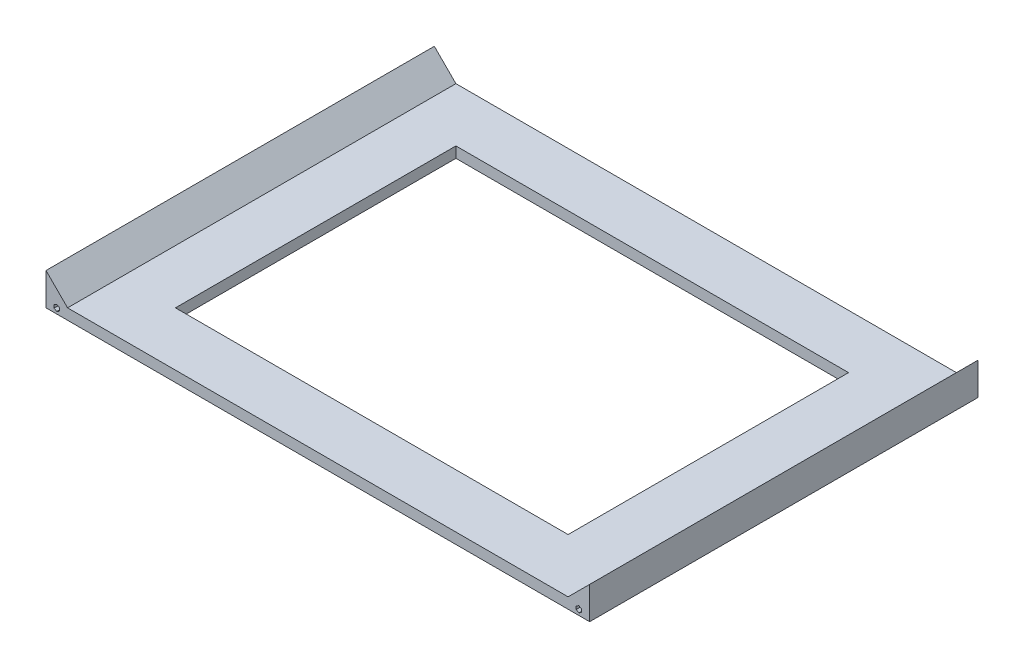
ISO-10303-21;
HEADER;
FILE_DESCRIPTION(('STEP AP214'),'2;1');
FILE_NAME('part.step','',(''),(''),'','','');
FILE_SCHEMA(('AUTOMOTIVE_DESIGN { 1 0 10303 214 1 1 1 1 }'));
ENDSEC;
DATA;
#1=APPLICATION_CONTEXT('core data for automotive mechanical design processes');
#2=APPLICATION_PROTOCOL_DEFINITION('international standard','automotive_design',2000,#1);
#3=PRODUCT_CONTEXT('',#1,'mechanical');
#4=PRODUCT('Part','Part','',(#3));
#5=PRODUCT_RELATED_PRODUCT_CATEGORY('part','',(#4));
#6=PRODUCT_DEFINITION_FORMATION('','',#4);
#7=PRODUCT_DEFINITION_CONTEXT('part definition',#1,'design');
#8=PRODUCT_DEFINITION('design','',#6,#7);
#9=PRODUCT_DEFINITION_SHAPE('','',#8);
#10=(LENGTH_UNIT() NAMED_UNIT(*) SI_UNIT(.MILLI.,.METRE.));
#11=(NAMED_UNIT(*) PLANE_ANGLE_UNIT() SI_UNIT($,.RADIAN.));
#12=(NAMED_UNIT(*) SI_UNIT($,.STERADIAN.) SOLID_ANGLE_UNIT());
#13=UNCERTAINTY_MEASURE_WITH_UNIT(LENGTH_MEASURE(1.E-05),#10,'distance_accuracy_value','');
#14=(GEOMETRIC_REPRESENTATION_CONTEXT(3) GLOBAL_UNCERTAINTY_ASSIGNED_CONTEXT((#13)) GLOBAL_UNIT_ASSIGNED_CONTEXT((#10,
#11,#12)) REPRESENTATION_CONTEXT('',''));
#15=CARTESIAN_POINT('',(0.,0.,0.));
#16=DIRECTION('',(0.,0.,1.));
#17=DIRECTION('',(1.,0.,0.));
#18=AXIS2_PLACEMENT_3D('',#15,#16,#17);
#19=CARTESIAN_POINT('',(-126.,0.,-90.));
#20=DIRECTION('',(-1.,0.,0.));
#21=DIRECTION('',(0.,0.,1.));
#22=AXIS2_PLACEMENT_3D('',#19,#20,#21);
#23=PLANE('',#22);
#24=DIRECTION('',(0.,0.,1.));
#25=VECTOR('',#24,1.);
#26=CARTESIAN_POINT('',(-126.,0.,-90.));
#27=LINE('',#26,#25);
#28=CARTESIAN_POINT('',(-126.,0.,-90.));
#29=VERTEX_POINT('',#28);
#30=CARTESIAN_POINT('',(-126.,0.,90.));
#31=VERTEX_POINT('',#30);
#32=EDGE_CURVE('E48',#29,#31,#27,.T.);
#33=ORIENTED_EDGE('',*,*,#32,.T.);
#34=DIRECTION('',(0.,-1.,0.));
#35=VECTOR('',#34,1.);
#36=CARTESIAN_POINT('',(-126.,0.,90.));
#37=LINE('',#36,#35);
#38=CARTESIAN_POINT('',(-126.,15.,90.));
#39=VERTEX_POINT('',#38);
#40=EDGE_CURVE('E276',#39,#31,#37,.T.);
#41=ORIENTED_EDGE('',*,*,#40,.F.);
#42=DIRECTION('',(0.,0.,1.));
#43=VECTOR('',#42,1.);
#44=CARTESIAN_POINT('',(-126.,15.,-90.));
#45=LINE('',#44,#43);
#46=CARTESIAN_POINT('',(-126.,15.,-90.));
#47=VERTEX_POINT('',#46);
#48=EDGE_CURVE('E11',#47,#39,#45,.T.);
#49=ORIENTED_EDGE('',*,*,#48,.F.);
#50=DIRECTION('',(0.,-1.,0.));
#51=VECTOR('',#50,1.);
#52=CARTESIAN_POINT('',(-126.,0.,-90.));
#53=LINE('',#52,#51);
#54=EDGE_CURVE('E364',#47,#29,#53,.T.);
#55=ORIENTED_EDGE('',*,*,#54,.T.);
#56=EDGE_LOOP('',(#33,#41,#49,#55));
#57=FACE_BOUND('',#56,.T.);
#58=ADVANCED_FACE('F45',(#57),#23,.T.);
#59=CARTESIAN_POINT('',(-126.,15.,-90.));
#60=DIRECTION('',(0.707106781186549,0.707106781186546,0.));
#61=DIRECTION('',(-0.707106781186546,0.707106781186549,0.));
#62=AXIS2_PLACEMENT_3D('',#59,#60,#61);
#63=PLANE('',#62);
#64=ORIENTED_EDGE('',*,*,#48,.T.);
#65=DIRECTION('',(-0.707106781186546,0.707106781186549,0.));
#66=VECTOR('',#65,1.);
#67=CARTESIAN_POINT('',(-126.,15.,90.));
#68=LINE('',#67,#66);
#69=CARTESIAN_POINT('',(-116.,5.,90.));
#70=VERTEX_POINT('',#69);
#71=EDGE_CURVE('E361',#70,#39,#68,.T.);
#72=ORIENTED_EDGE('',*,*,#71,.F.);
#73=DIRECTION('',(0.,0.,1.));
#74=VECTOR('',#73,1.);
#75=CARTESIAN_POINT('',(-116.,5.,-90.));
#76=LINE('',#75,#74);
#77=CARTESIAN_POINT('',(-116.,5.,-90.));
#78=VERTEX_POINT('',#77);
#79=EDGE_CURVE('E53',#78,#70,#76,.T.);
#80=ORIENTED_EDGE('',*,*,#79,.F.);
#81=DIRECTION('',(-0.707106781186546,0.707106781186549,0.));
#82=VECTOR('',#81,1.);
#83=CARTESIAN_POINT('',(-126.,15.,-90.));
#84=LINE('',#83,#82);
#85=EDGE_CURVE('E379',#78,#47,#84,.T.);
#86=ORIENTED_EDGE('',*,*,#85,.T.);
#87=EDGE_LOOP('',(#64,#72,#80,#86));
#88=FACE_BOUND('',#87,.T.);
#89=ADVANCED_FACE('F399',(#88),#63,.T.);
#90=CARTESIAN_POINT('',(-116.,5.,-90.));
#91=DIRECTION('',(0.,1.,0.));
#92=DIRECTION('',(0.,0.,1.));
#93=AXIS2_PLACEMENT_3D('',#90,#91,#92);
#94=PLANE('',#93);
#95=DIRECTION('',(-1.,0.,0.));
#96=VECTOR('',#95,1.);
#97=CARTESIAN_POINT('',(91.,5.,-65.));
#98=LINE('',#97,#96);
#99=CARTESIAN_POINT('',(91.,5.,-65.));
#100=VERTEX_POINT('',#99);
#101=CARTESIAN_POINT('',(-91.,5.,-65.));
#102=VERTEX_POINT('',#101);
#103=EDGE_CURVE('E61',#100,#102,#98,.T.);
#104=ORIENTED_EDGE('',*,*,#103,.F.);
#105=DIRECTION('',(0.,0.,-1.));
#106=VECTOR('',#105,1.);
#107=CARTESIAN_POINT('',(91.,5.,65.));
#108=LINE('',#107,#106);
#109=CARTESIAN_POINT('',(91.,5.,65.));
#110=VERTEX_POINT('',#109);
#111=EDGE_CURVE('E218',#110,#100,#108,.T.);
#112=ORIENTED_EDGE('',*,*,#111,.F.);
#113=DIRECTION('',(1.,0.,0.));
#114=VECTOR('',#113,1.);
#115=CARTESIAN_POINT('',(-91.,5.,65.));
#116=LINE('',#115,#114);
#117=CARTESIAN_POINT('',(-91.,5.,65.));
#118=VERTEX_POINT('',#117);
#119=EDGE_CURVE('E221',#118,#110,#116,.T.);
#120=ORIENTED_EDGE('',*,*,#119,.F.);
#121=DIRECTION('',(0.,0.,1.));
#122=VECTOR('',#121,1.);
#123=CARTESIAN_POINT('',(-91.,5.,-65.));
#124=LINE('',#123,#122);
#125=EDGE_CURVE('E227',#102,#118,#124,.T.);
#126=ORIENTED_EDGE('',*,*,#125,.F.);
#127=EDGE_LOOP('',(#104,#112,#120,#126));
#128=FACE_BOUND('',#127,.T.);
#129=ORIENTED_EDGE('',*,*,#79,.T.);
#130=DIRECTION('',(-1.,0.,0.));
#131=VECTOR('',#130,1.);
#132=CARTESIAN_POINT('',(-116.,5.,90.));
#133=LINE('',#132,#131);
#134=CARTESIAN_POINT('',(116.,5.,90.));
#135=VERTEX_POINT('',#134);
#136=EDGE_CURVE('E358',#135,#70,#133,.T.);
#137=ORIENTED_EDGE('',*,*,#136,.F.);
#138=DIRECTION('',(0.,0.,1.));
#139=VECTOR('',#138,1.);
#140=CARTESIAN_POINT('',(116.,5.,-90.));
#141=LINE('',#140,#139);
#142=CARTESIAN_POINT('',(116.,5.,-90.));
#143=VERTEX_POINT('',#142);
#144=EDGE_CURVE('E383',#143,#135,#141,.T.);
#145=ORIENTED_EDGE('',*,*,#144,.F.);
#146=DIRECTION('',(-1.,0.,0.));
#147=VECTOR('',#146,1.);
#148=CARTESIAN_POINT('',(-116.,5.,-90.));
#149=LINE('',#148,#147);
#150=EDGE_CURVE('E376',#143,#78,#149,.T.);
#151=ORIENTED_EDGE('',*,*,#150,.T.);
#152=EDGE_LOOP('',(#129,#137,#145,#151));
#153=FACE_BOUND('',#152,.T.);
#154=ADVANCED_FACE('F412',(#128,#153),#94,.T.);
#155=CARTESIAN_POINT('',(116.,5.,-90.));
#156=DIRECTION('',(-0.707106781186549,0.707106781186546,0.));
#157=DIRECTION('',(-0.707106781186546,-0.707106781186549,0.));
#158=AXIS2_PLACEMENT_3D('',#155,#156,#157);
#159=PLANE('',#158);
#160=ORIENTED_EDGE('',*,*,#144,.T.);
#161=DIRECTION('',(-0.707106781186546,-0.707106781186549,0.));
#162=VECTOR('',#161,1.);
#163=CARTESIAN_POINT('',(116.,5.,90.));
#164=LINE('',#163,#162);
#165=CARTESIAN_POINT('',(126.,15.,90.));
#166=VERTEX_POINT('',#165);
#167=EDGE_CURVE('E355',#166,#135,#164,.T.);
#168=ORIENTED_EDGE('',*,*,#167,.F.);
#169=DIRECTION('',(0.,0.,1.));
#170=VECTOR('',#169,1.);
#171=CARTESIAN_POINT('',(126.,15.,-90.));
#172=LINE('',#171,#170);
#173=CARTESIAN_POINT('',(126.,15.,-90.));
#174=VERTEX_POINT('',#173);
#175=EDGE_CURVE('E385',#174,#166,#172,.T.);
#176=ORIENTED_EDGE('',*,*,#175,.F.);
#177=DIRECTION('',(-0.707106781186546,-0.707106781186549,0.));
#178=VECTOR('',#177,1.);
#179=CARTESIAN_POINT('',(116.,5.,-90.));
#180=LINE('',#179,#178);
#181=EDGE_CURVE('E373',#174,#143,#180,.T.);
#182=ORIENTED_EDGE('',*,*,#181,.T.);
#183=EDGE_LOOP('',(#160,#168,#176,#182));
#184=FACE_BOUND('',#183,.T.);
#185=ADVANCED_FACE('F410',(#184),#159,.T.);
#186=CARTESIAN_POINT('',(126.,15.,-90.));
#187=DIRECTION('',(1.,0.,0.));
#188=DIRECTION('',(0.,0.,-1.));
#189=AXIS2_PLACEMENT_3D('',#186,#187,#188);
#190=PLANE('',#189);
#191=ORIENTED_EDGE('',*,*,#175,.T.);
#192=DIRECTION('',(0.,1.,0.));
#193=VECTOR('',#192,1.);
#194=CARTESIAN_POINT('',(126.,15.,90.));
#195=LINE('',#194,#193);
#196=CARTESIAN_POINT('',(126.,0.,90.));
#197=VERTEX_POINT('',#196);
#198=EDGE_CURVE('E352',#197,#166,#195,.T.);
#199=ORIENTED_EDGE('',*,*,#198,.F.);
#200=DIRECTION('',(0.,0.,1.));
#201=VECTOR('',#200,1.);
#202=CARTESIAN_POINT('',(126.,0.,-90.));
#203=LINE('',#202,#201);
#204=CARTESIAN_POINT('',(126.,0.,-90.));
#205=VERTEX_POINT('',#204);
#206=EDGE_CURVE('E386',#205,#197,#203,.T.);
#207=ORIENTED_EDGE('',*,*,#206,.F.);
#208=DIRECTION('',(0.,1.,0.));
#209=VECTOR('',#208,1.);
#210=CARTESIAN_POINT('',(126.,15.,-90.));
#211=LINE('',#210,#209);
#212=EDGE_CURVE('E370',#205,#174,#211,.T.);
#213=ORIENTED_EDGE('',*,*,#212,.T.);
#214=EDGE_LOOP('',(#191,#199,#207,#213));
#215=FACE_BOUND('',#214,.T.);
#216=ADVANCED_FACE('F407',(#215),#190,.T.);
#217=CARTESIAN_POINT('',(-126.,0.,-90.));
#218=DIRECTION('',(0.,-1.,0.));
#219=DIRECTION('',(0.,0.,-1.));
#220=AXIS2_PLACEMENT_3D('',#217,#218,#219);
#221=PLANE('',#220);
#222=DIRECTION('',(-1.,0.,0.));
#223=VECTOR('',#222,1.);
#224=CARTESIAN_POINT('',(91.,0.,-65.));
#225=LINE('',#224,#223);
#226=CARTESIAN_POINT('',(91.,0.,-65.));
#227=VERTEX_POINT('',#226);
#228=CARTESIAN_POINT('',(-91.,0.,-65.));
#229=VERTEX_POINT('',#228);
#230=EDGE_CURVE('E202',#227,#229,#225,.T.);
#231=ORIENTED_EDGE('',*,*,#230,.T.);
#232=DIRECTION('',(0.,0.,1.));
#233=VECTOR('',#232,1.);
#234=CARTESIAN_POINT('',(-91.,0.,-65.));
#235=LINE('',#234,#233);
#236=CARTESIAN_POINT('',(-91.,0.,65.));
#237=VERTEX_POINT('',#236);
#238=EDGE_CURVE('E211',#229,#237,#235,.T.);
#239=ORIENTED_EDGE('',*,*,#238,.T.);
#240=DIRECTION('',(1.,0.,0.));
#241=VECTOR('',#240,1.);
#242=CARTESIAN_POINT('',(-91.,0.,65.));
#243=LINE('',#242,#241);
#244=CARTESIAN_POINT('',(91.,0.,65.));
#245=VERTEX_POINT('',#244);
#246=EDGE_CURVE('E69',#237,#245,#243,.T.);
#247=ORIENTED_EDGE('',*,*,#246,.T.);
#248=DIRECTION('',(0.,0.,-1.));
#249=VECTOR('',#248,1.);
#250=CARTESIAN_POINT('',(91.,0.,65.));
#251=LINE('',#250,#249);
#252=EDGE_CURVE('E208',#245,#227,#251,.T.);
#253=ORIENTED_EDGE('',*,*,#252,.T.);
#254=EDGE_LOOP('',(#231,#239,#247,#253));
#255=FACE_BOUND('',#254,.T.);
#256=ORIENTED_EDGE('',*,*,#206,.T.);
#257=DIRECTION('',(1.,0.,0.));
#258=VECTOR('',#257,1.);
#259=CARTESIAN_POINT('',(-126.,0.,90.));
#260=LINE('',#259,#258);
#261=EDGE_CURVE('E348',#31,#197,#260,.T.);
#262=ORIENTED_EDGE('',*,*,#261,.F.);
#263=ORIENTED_EDGE('',*,*,#32,.F.);
#264=DIRECTION('',(1.,0.,0.));
#265=VECTOR('',#264,1.);
#266=CARTESIAN_POINT('',(-126.,0.,-90.));
#267=LINE('',#266,#265);
#268=EDGE_CURVE('E367',#29,#205,#267,.T.);
#269=ORIENTED_EDGE('',*,*,#268,.T.);
#270=EDGE_LOOP('',(#256,#262,#263,#269));
#271=FACE_BOUND('',#270,.T.);
#272=ADVANCED_FACE('F215',(#255,#271),#221,.T.);
#273=CARTESIAN_POINT('',(0.,0.,-90.));
#274=DIRECTION('',(0.,0.,-1.));
#275=DIRECTION('',(-1.,0.,0.));
#276=AXIS2_PLACEMENT_3D('',#273,#274,#275);
#277=PLANE('',#276);
#278=DIRECTION('',(0.,-1.,0.));
#279=VECTOR('',#278,1.);
#280=CARTESIAN_POINT('',(119.75,1.77831216351297,-90.));
#281=LINE('',#280,#279);
#282=CARTESIAN_POINT('',(119.75,3.22168783648702,-90.));
#283=VERTEX_POINT('',#282);
#284=CARTESIAN_POINT('',(119.75,1.77831216351297,-90.));
#285=VERTEX_POINT('',#284);
#286=EDGE_CURVE('E237',#283,#285,#281,.T.);
#287=ORIENTED_EDGE('',*,*,#286,.T.);
#288=DIRECTION('',(0.866025403784439,-0.5,0.));
#289=VECTOR('',#288,1.);
#290=CARTESIAN_POINT('',(121.,1.05662432702594,-90.));
#291=LINE('',#290,#289);
#292=CARTESIAN_POINT('',(121.,1.05662432702594,-90.));
#293=VERTEX_POINT('',#292);
#294=EDGE_CURVE('E240',#285,#293,#291,.T.);
#295=ORIENTED_EDGE('',*,*,#294,.T.);
#296=DIRECTION('',(0.866025403784438,0.500000000000001,0.));
#297=VECTOR('',#296,1.);
#298=CARTESIAN_POINT('',(122.25,1.77831216351296,-90.));
#299=LINE('',#298,#297);
#300=CARTESIAN_POINT('',(122.25,1.77831216351296,-90.));
#301=VERTEX_POINT('',#300);
#302=EDGE_CURVE('E244',#293,#301,#299,.T.);
#303=ORIENTED_EDGE('',*,*,#302,.T.);
#304=DIRECTION('',(0.,1.,0.));
#305=VECTOR('',#304,1.);
#306=CARTESIAN_POINT('',(122.25,3.22168783648703,-90.));
#307=LINE('',#306,#305);
#308=CARTESIAN_POINT('',(122.25,3.22168783648703,-90.));
#309=VERTEX_POINT('',#308);
#310=EDGE_CURVE('E247',#301,#309,#307,.T.);
#311=ORIENTED_EDGE('',*,*,#310,.T.);
#312=DIRECTION('',(-0.866025403784439,0.499999999999999,0.));
#313=VECTOR('',#312,1.);
#314=CARTESIAN_POINT('',(121.,3.94337567297405,-90.));
#315=LINE('',#314,#313);
#316=CARTESIAN_POINT('',(121.,3.94337567297405,-90.));
#317=VERTEX_POINT('',#316);
#318=EDGE_CURVE('E250',#309,#317,#315,.T.);
#319=ORIENTED_EDGE('',*,*,#318,.T.);
#320=DIRECTION('',(-0.866025403784438,-0.500000000000002,0.));
#321=VECTOR('',#320,1.);
#322=CARTESIAN_POINT('',(119.75,3.22168783648702,-90.));
#323=LINE('',#322,#321);
#324=EDGE_CURVE('E253',#317,#283,#323,.T.);
#325=ORIENTED_EDGE('',*,*,#324,.T.);
#326=EDGE_LOOP('',(#287,#295,#303,#311,#319,#325));
#327=FACE_BOUND('',#326,.T.);
#328=DIRECTION('',(-0.866025403784438,0.500000000000002,0.));
#329=VECTOR('',#328,1.);
#330=CARTESIAN_POINT('',(-119.75,3.22168783648702,-90.));
#331=LINE('',#330,#329);
#332=CARTESIAN_POINT('',(-119.75,3.22168783648702,-90.));
#333=VERTEX_POINT('',#332);
#334=CARTESIAN_POINT('',(-121.,3.94337567297405,-90.));
#335=VERTEX_POINT('',#334);
#336=EDGE_CURVE('E311',#333,#335,#331,.T.);
#337=ORIENTED_EDGE('',*,*,#336,.T.);
#338=DIRECTION('',(-0.866025403784439,-0.499999999999999,0.));
#339=VECTOR('',#338,1.);
#340=CARTESIAN_POINT('',(-121.,3.94337567297405,-90.));
#341=LINE('',#340,#339);
#342=CARTESIAN_POINT('',(-122.25,3.22168783648703,-90.));
#343=VERTEX_POINT('',#342);
#344=EDGE_CURVE('E340',#335,#343,#341,.T.);
#345=ORIENTED_EDGE('',*,*,#344,.T.);
#346=DIRECTION('',(0.,-1.,0.));
#347=VECTOR('',#346,1.);
#348=CARTESIAN_POINT('',(-122.25,3.22168783648703,-90.));
#349=LINE('',#348,#347);
#350=CARTESIAN_POINT('',(-122.25,1.77831216351296,-90.));
#351=VERTEX_POINT('',#350);
#352=EDGE_CURVE('E337',#343,#351,#349,.T.);
#353=ORIENTED_EDGE('',*,*,#352,.T.);
#354=DIRECTION('',(0.866025403784438,-0.500000000000001,0.));
#355=VECTOR('',#354,1.);
#356=CARTESIAN_POINT('',(-122.25,1.77831216351296,-90.));
#357=LINE('',#356,#355);
#358=CARTESIAN_POINT('',(-121.,1.05662432702594,-90.));
#359=VERTEX_POINT('',#358);
#360=EDGE_CURVE('E334',#351,#359,#357,.T.);
#361=ORIENTED_EDGE('',*,*,#360,.T.);
#362=DIRECTION('',(0.866025403784439,0.5,0.));
#363=VECTOR('',#362,1.);
#364=CARTESIAN_POINT('',(-121.,1.05662432702594,-90.));
#365=LINE('',#364,#363);
#366=CARTESIAN_POINT('',(-119.75,1.77831216351297,-90.));
#367=VERTEX_POINT('',#366);
#368=EDGE_CURVE('E331',#359,#367,#365,.T.);
#369=ORIENTED_EDGE('',*,*,#368,.T.);
#370=DIRECTION('',(0.,1.,0.));
#371=VECTOR('',#370,1.);
#372=CARTESIAN_POINT('',(-119.75,1.77831216351297,-90.));
#373=LINE('',#372,#371);
#374=EDGE_CURVE('E291',#367,#333,#373,.T.);
#375=ORIENTED_EDGE('',*,*,#374,.T.);
#376=EDGE_LOOP('',(#337,#345,#353,#361,#369,#375));
#377=FACE_BOUND('',#376,.T.);
#378=ORIENTED_EDGE('',*,*,#54,.F.);
#379=ORIENTED_EDGE('',*,*,#85,.F.);
#380=ORIENTED_EDGE('',*,*,#150,.F.);
#381=ORIENTED_EDGE('',*,*,#181,.F.);
#382=ORIENTED_EDGE('',*,*,#212,.F.);
#383=ORIENTED_EDGE('',*,*,#268,.F.);
#384=EDGE_LOOP('',(#378,#379,#380,#381,#382,#383));
#385=FACE_BOUND('',#384,.T.);
#386=ADVANCED_FACE('F402',(#327,#377,#385),#277,.T.);
#387=CARTESIAN_POINT('',(0.,0.,90.));
#388=DIRECTION('',(0.,0.,-1.));
#389=DIRECTION('',(-1.,0.,0.));
#390=AXIS2_PLACEMENT_3D('',#387,#388,#389);
#391=PLANE('',#390);
#392=DIRECTION('',(0.866025403784439,-0.5,0.));
#393=VECTOR('',#392,1.);
#394=CARTESIAN_POINT('',(121.,1.05662432702594,90.));
#395=LINE('',#394,#393);
#396=CARTESIAN_POINT('',(119.75,1.77831216351297,90.));
#397=VERTEX_POINT('',#396);
#398=CARTESIAN_POINT('',(121.,1.05662432702594,90.));
#399=VERTEX_POINT('',#398);
#400=EDGE_CURVE('E259',#397,#399,#395,.T.);
#401=ORIENTED_EDGE('',*,*,#400,.F.);
#402=DIRECTION('',(0.,-1.,0.));
#403=VECTOR('',#402,1.);
#404=CARTESIAN_POINT('',(119.75,1.77831216351297,90.));
#405=LINE('',#404,#403);
#406=CARTESIAN_POINT('',(119.75,3.22168783648702,90.));
#407=VERTEX_POINT('',#406);
#408=EDGE_CURVE('E257',#407,#397,#405,.T.);
#409=ORIENTED_EDGE('',*,*,#408,.F.);
#410=DIRECTION('',(-0.866025403784438,-0.500000000000002,0.));
#411=VECTOR('',#410,1.);
#412=CARTESIAN_POINT('',(119.75,3.22168783648702,90.));
#413=LINE('',#412,#411);
#414=CARTESIAN_POINT('',(121.,3.94337567297405,90.));
#415=VERTEX_POINT('',#414);
#416=EDGE_CURVE('E241',#415,#407,#413,.T.);
#417=ORIENTED_EDGE('',*,*,#416,.F.);
#418=DIRECTION('',(-0.866025403784439,0.499999999999999,0.));
#419=VECTOR('',#418,1.);
#420=CARTESIAN_POINT('',(121.,3.94337567297405,90.));
#421=LINE('',#420,#419);
#422=CARTESIAN_POINT('',(122.25,3.22168783648703,90.));
#423=VERTEX_POINT('',#422);
#424=EDGE_CURVE('E269',#423,#415,#421,.T.);
#425=ORIENTED_EDGE('',*,*,#424,.F.);
#426=DIRECTION('',(0.,1.,0.));
#427=VECTOR('',#426,1.);
#428=CARTESIAN_POINT('',(122.25,3.22168783648703,90.));
#429=LINE('',#428,#427);
#430=CARTESIAN_POINT('',(122.25,1.77831216351296,90.));
#431=VERTEX_POINT('',#430);
#432=EDGE_CURVE('E266',#431,#423,#429,.T.);
#433=ORIENTED_EDGE('',*,*,#432,.F.);
#434=DIRECTION('',(0.866025403784438,0.500000000000001,0.));
#435=VECTOR('',#434,1.);
#436=CARTESIAN_POINT('',(122.25,1.77831216351296,90.));
#437=LINE('',#436,#435);
#438=EDGE_CURVE('E263',#399,#431,#437,.T.);
#439=ORIENTED_EDGE('',*,*,#438,.F.);
#440=EDGE_LOOP('',(#401,#409,#417,#425,#433,#439));
#441=FACE_BOUND('',#440,.T.);
#442=DIRECTION('',(-0.866025403784439,-0.499999999999999,0.));
#443=VECTOR('',#442,1.);
#444=CARTESIAN_POINT('',(-121.,3.94337567297405,90.));
#445=LINE('',#444,#443);
#446=CARTESIAN_POINT('',(-121.,3.94337567297406,90.));
#447=VERTEX_POINT('',#446);
#448=CARTESIAN_POINT('',(-122.25,3.22168783648703,90.));
#449=VERTEX_POINT('',#448);
#450=EDGE_CURVE('E323',#447,#449,#445,.T.);
#451=ORIENTED_EDGE('',*,*,#450,.F.);
#452=DIRECTION('',(-0.866025403784438,0.500000000000002,0.));
#453=VECTOR('',#452,1.);
#454=CARTESIAN_POINT('',(-119.75,3.22168783648702,90.));
#455=LINE('',#454,#453);
#456=CARTESIAN_POINT('',(-119.75,3.22168783648702,90.));
#457=VERTEX_POINT('',#456);
#458=EDGE_CURVE('E260',#457,#447,#455,.T.);
#459=ORIENTED_EDGE('',*,*,#458,.F.);
#460=DIRECTION('',(0.,1.,0.));
#461=VECTOR('',#460,1.);
#462=CARTESIAN_POINT('',(-119.75,1.77831216351297,90.));
#463=LINE('',#462,#461);
#464=CARTESIAN_POINT('',(-119.75,1.77831216351297,90.));
#465=VERTEX_POINT('',#464);
#466=EDGE_CURVE('E306',#465,#457,#463,.T.);
#467=ORIENTED_EDGE('',*,*,#466,.F.);
#468=DIRECTION('',(0.866025403784439,0.5,0.));
#469=VECTOR('',#468,1.);
#470=CARTESIAN_POINT('',(-121.,1.05662432702594,90.));
#471=LINE('',#470,#469);
#472=CARTESIAN_POINT('',(-121.,1.05662432702594,90.));
#473=VERTEX_POINT('',#472);
#474=EDGE_CURVE('E310',#473,#465,#471,.T.);
#475=ORIENTED_EDGE('',*,*,#474,.F.);
#476=DIRECTION('',(0.866025403784438,-0.500000000000001,0.));
#477=VECTOR('',#476,1.);
#478=CARTESIAN_POINT('',(-122.25,1.77831216351296,90.));
#479=LINE('',#478,#477);
#480=CARTESIAN_POINT('',(-122.25,1.77831216351296,90.));
#481=VERTEX_POINT('',#480);
#482=EDGE_CURVE('E315',#481,#473,#479,.T.);
#483=ORIENTED_EDGE('',*,*,#482,.F.);
#484=DIRECTION('',(0.,-1.,0.));
#485=VECTOR('',#484,1.);
#486=CARTESIAN_POINT('',(-122.25,3.22168783648703,90.));
#487=LINE('',#486,#485);
#488=EDGE_CURVE('E319',#449,#481,#487,.T.);
#489=ORIENTED_EDGE('',*,*,#488,.F.);
#490=EDGE_LOOP('',(#451,#459,#467,#475,#483,#489));
#491=FACE_BOUND('',#490,.T.);
#492=ORIENTED_EDGE('',*,*,#40,.T.);
#493=ORIENTED_EDGE('',*,*,#261,.T.);
#494=ORIENTED_EDGE('',*,*,#198,.T.);
#495=ORIENTED_EDGE('',*,*,#167,.T.);
#496=ORIENTED_EDGE('',*,*,#136,.T.);
#497=ORIENTED_EDGE('',*,*,#71,.T.);
#498=EDGE_LOOP('',(#492,#493,#494,#495,#496,#497));
#499=FACE_BOUND('',#498,.T.);
#500=ADVANCED_FACE('F395',(#441,#491,#499),#391,.F.);
#501=CARTESIAN_POINT('',(-119.75,3.22168783648702,-90.));
#502=DIRECTION('',(0.500000000000002,0.866025403784438,0.));
#503=DIRECTION('',(-0.866025403784438,0.500000000000002,0.));
#504=AXIS2_PLACEMENT_3D('',#501,#502,#503);
#505=PLANE('',#504);
#506=ORIENTED_EDGE('',*,*,#458,.T.);
#507=DIRECTION('',(0.,0.,1.));
#508=VECTOR('',#507,1.);
#509=CARTESIAN_POINT('',(-121.,3.94337567297405,-90.));
#510=LINE('',#509,#508);
#511=EDGE_CURVE('E287',#335,#447,#510,.T.);
#512=ORIENTED_EDGE('',*,*,#511,.F.);
#513=ORIENTED_EDGE('',*,*,#336,.F.);
#514=DIRECTION('',(0.,0.,1.));
#515=VECTOR('',#514,1.);
#516=CARTESIAN_POINT('',(-119.75,3.22168783648702,-90.));
#517=LINE('',#516,#515);
#518=EDGE_CURVE('E233',#333,#457,#517,.T.);
#519=ORIENTED_EDGE('',*,*,#518,.T.);
#520=EDGE_LOOP('',(#506,#512,#513,#519));
#521=FACE_BOUND('',#520,.T.);
#522=ADVANCED_FACE('F461',(#521),#505,.F.);
#523=CARTESIAN_POINT('',(-119.75,1.77831216351297,-90.));
#524=DIRECTION('',(1.,0.,0.));
#525=DIRECTION('',(0.,0.,-1.));
#526=AXIS2_PLACEMENT_3D('',#523,#524,#525);
#527=PLANE('',#526);
#528=ORIENTED_EDGE('',*,*,#466,.T.);
#529=ORIENTED_EDGE('',*,*,#518,.F.);
#530=ORIENTED_EDGE('',*,*,#374,.F.);
#531=DIRECTION('',(0.,0.,1.));
#532=VECTOR('',#531,1.);
#533=CARTESIAN_POINT('',(-119.75,1.77831216351297,-90.));
#534=LINE('',#533,#532);
#535=EDGE_CURVE('E301',#367,#465,#534,.T.);
#536=ORIENTED_EDGE('',*,*,#535,.T.);
#537=EDGE_LOOP('',(#528,#529,#530,#536));
#538=FACE_BOUND('',#537,.T.);
#539=ADVANCED_FACE('F471',(#538),#527,.F.);
#540=CARTESIAN_POINT('',(-121.,1.05662432702594,-90.));
#541=DIRECTION('',(0.5,-0.866025403784439,0.));
#542=DIRECTION('',(0.866025403784439,0.5,0.));
#543=AXIS2_PLACEMENT_3D('',#540,#541,#542);
#544=PLANE('',#543);
#545=ORIENTED_EDGE('',*,*,#474,.T.);
#546=ORIENTED_EDGE('',*,*,#535,.F.);
#547=ORIENTED_EDGE('',*,*,#368,.F.);
#548=DIRECTION('',(0.,0.,1.));
#549=VECTOR('',#548,1.);
#550=CARTESIAN_POINT('',(-121.,1.05662432702594,-90.));
#551=LINE('',#550,#549);
#552=EDGE_CURVE('E298',#359,#473,#551,.T.);
#553=ORIENTED_EDGE('',*,*,#552,.T.);
#554=EDGE_LOOP('',(#545,#546,#547,#553));
#555=FACE_BOUND('',#554,.T.);
#556=ADVANCED_FACE('F480',(#555),#544,.F.);
#557=CARTESIAN_POINT('',(-122.25,1.77831216351296,-90.));
#558=DIRECTION('',(-0.500000000000001,-0.866025403784438,0.));
#559=DIRECTION('',(0.866025403784438,-0.500000000000001,0.));
#560=AXIS2_PLACEMENT_3D('',#557,#558,#559);
#561=PLANE('',#560);
#562=ORIENTED_EDGE('',*,*,#482,.T.);
#563=ORIENTED_EDGE('',*,*,#552,.F.);
#564=ORIENTED_EDGE('',*,*,#360,.F.);
#565=DIRECTION('',(0.,0.,1.));
#566=VECTOR('',#565,1.);
#567=CARTESIAN_POINT('',(-122.25,1.77831216351296,-90.));
#568=LINE('',#567,#566);
#569=EDGE_CURVE('E295',#351,#481,#568,.T.);
#570=ORIENTED_EDGE('',*,*,#569,.T.);
#571=EDGE_LOOP('',(#562,#563,#564,#570));
#572=FACE_BOUND('',#571,.T.);
#573=ADVANCED_FACE('F489',(#572),#561,.F.);
#574=CARTESIAN_POINT('',(-122.25,3.22168783648703,-90.));
#575=DIRECTION('',(-1.,0.,0.));
#576=DIRECTION('',(0.,0.,1.));
#577=AXIS2_PLACEMENT_3D('',#574,#575,#576);
#578=PLANE('',#577);
#579=ORIENTED_EDGE('',*,*,#488,.T.);
#580=ORIENTED_EDGE('',*,*,#569,.F.);
#581=ORIENTED_EDGE('',*,*,#352,.F.);
#582=DIRECTION('',(0.,0.,1.));
#583=VECTOR('',#582,1.);
#584=CARTESIAN_POINT('',(-122.25,3.22168783648703,-90.));
#585=LINE('',#584,#583);
#586=EDGE_CURVE('E292',#343,#449,#585,.T.);
#587=ORIENTED_EDGE('',*,*,#586,.T.);
#588=EDGE_LOOP('',(#579,#580,#581,#587));
#589=FACE_BOUND('',#588,.T.);
#590=ADVANCED_FACE('F498',(#589),#578,.F.);
#591=CARTESIAN_POINT('',(-121.,3.94337567297405,-90.));
#592=DIRECTION('',(-0.499999999999999,0.866025403784439,0.));
#593=DIRECTION('',(-0.866025403784439,-0.499999999999999,0.));
#594=AXIS2_PLACEMENT_3D('',#591,#592,#593);
#595=PLANE('',#594);
#596=ORIENTED_EDGE('',*,*,#450,.T.);
#597=ORIENTED_EDGE('',*,*,#586,.F.);
#598=ORIENTED_EDGE('',*,*,#344,.F.);
#599=ORIENTED_EDGE('',*,*,#511,.T.);
#600=EDGE_LOOP('',(#596,#597,#598,#599));
#601=FACE_BOUND('',#600,.T.);
#602=ADVANCED_FACE('F507',(#601),#595,.F.);
#603=CARTESIAN_POINT('',(119.75,1.77831216351297,-90.));
#604=DIRECTION('',(-1.,0.,0.));
#605=DIRECTION('',(0.,0.,1.));
#606=AXIS2_PLACEMENT_3D('',#603,#604,#605);
#607=PLANE('',#606);
#608=ORIENTED_EDGE('',*,*,#408,.T.);
#609=DIRECTION('',(0.,0.,1.));
#610=VECTOR('',#609,1.);
#611=CARTESIAN_POINT('',(119.75,1.77831216351297,-90.));
#612=LINE('',#611,#610);
#613=EDGE_CURVE('E256',#285,#397,#612,.T.);
#614=ORIENTED_EDGE('',*,*,#613,.F.);
#615=ORIENTED_EDGE('',*,*,#286,.F.);
#616=DIRECTION('',(0.,0.,1.));
#617=VECTOR('',#616,1.);
#618=CARTESIAN_POINT('',(119.75,3.22168783648702,-90.));
#619=LINE('',#618,#617);
#620=EDGE_CURVE('E274',#283,#407,#619,.T.);
#621=ORIENTED_EDGE('',*,*,#620,.T.);
#622=EDGE_LOOP('',(#608,#614,#615,#621));
#623=FACE_BOUND('',#622,.T.);
#624=ADVANCED_FACE('F516',(#623),#607,.F.);
#625=CARTESIAN_POINT('',(119.75,3.22168783648702,-90.));
#626=DIRECTION('',(-0.500000000000002,0.866025403784438,0.));
#627=DIRECTION('',(-0.866025403784438,-0.500000000000002,0.));
#628=AXIS2_PLACEMENT_3D('',#625,#626,#627);
#629=PLANE('',#628);
#630=ORIENTED_EDGE('',*,*,#416,.T.);
#631=ORIENTED_EDGE('',*,*,#620,.F.);
#632=ORIENTED_EDGE('',*,*,#324,.F.);
#633=DIRECTION('',(0.,0.,1.));
#634=VECTOR('',#633,1.);
#635=CARTESIAN_POINT('',(121.,3.94337567297405,-90.));
#636=LINE('',#635,#634);
#637=EDGE_CURVE('E277',#317,#415,#636,.T.);
#638=ORIENTED_EDGE('',*,*,#637,.T.);
#639=EDGE_LOOP('',(#630,#631,#632,#638));
#640=FACE_BOUND('',#639,.T.);
#641=ADVANCED_FACE('F525',(#640),#629,.F.);
#642=CARTESIAN_POINT('',(121.,3.94337567297405,-90.));
#643=DIRECTION('',(0.499999999999999,0.866025403784439,0.));
#644=DIRECTION('',(-0.866025403784439,0.499999999999999,0.));
#645=AXIS2_PLACEMENT_3D('',#642,#643,#644);
#646=PLANE('',#645);
#647=ORIENTED_EDGE('',*,*,#424,.T.);
#648=ORIENTED_EDGE('',*,*,#637,.F.);
#649=ORIENTED_EDGE('',*,*,#318,.F.);
#650=DIRECTION('',(0.,0.,1.));
#651=VECTOR('',#650,1.);
#652=CARTESIAN_POINT('',(122.25,3.22168783648703,-90.));
#653=LINE('',#652,#651);
#654=EDGE_CURVE('E279',#309,#423,#653,.T.);
#655=ORIENTED_EDGE('',*,*,#654,.T.);
#656=EDGE_LOOP('',(#647,#648,#649,#655));
#657=FACE_BOUND('',#656,.T.);
#658=ADVANCED_FACE('F534',(#657),#646,.F.);
#659=CARTESIAN_POINT('',(122.25,3.22168783648703,-90.));
#660=DIRECTION('',(1.,0.,0.));
#661=DIRECTION('',(0.,0.,-1.));
#662=AXIS2_PLACEMENT_3D('',#659,#660,#661);
#663=PLANE('',#662);
#664=ORIENTED_EDGE('',*,*,#432,.T.);
#665=ORIENTED_EDGE('',*,*,#654,.F.);
#666=ORIENTED_EDGE('',*,*,#310,.F.);
#667=DIRECTION('',(0.,0.,1.));
#668=VECTOR('',#667,1.);
#669=CARTESIAN_POINT('',(122.25,1.77831216351296,-90.));
#670=LINE('',#669,#668);
#671=EDGE_CURVE('E281',#301,#431,#670,.T.);
#672=ORIENTED_EDGE('',*,*,#671,.T.);
#673=EDGE_LOOP('',(#664,#665,#666,#672));
#674=FACE_BOUND('',#673,.T.);
#675=ADVANCED_FACE('F543',(#674),#663,.F.);
#676=CARTESIAN_POINT('',(122.25,1.77831216351296,-90.));
#677=DIRECTION('',(0.500000000000001,-0.866025403784438,0.));
#678=DIRECTION('',(0.866025403784438,0.500000000000001,0.));
#679=AXIS2_PLACEMENT_3D('',#676,#677,#678);
#680=PLANE('',#679);
#681=ORIENTED_EDGE('',*,*,#438,.T.);
#682=ORIENTED_EDGE('',*,*,#671,.F.);
#683=ORIENTED_EDGE('',*,*,#302,.F.);
#684=DIRECTION('',(0.,0.,1.));
#685=VECTOR('',#684,1.);
#686=CARTESIAN_POINT('',(121.,1.05662432702594,-90.));
#687=LINE('',#686,#685);
#688=EDGE_CURVE('E283',#293,#399,#687,.T.);
#689=ORIENTED_EDGE('',*,*,#688,.T.);
#690=EDGE_LOOP('',(#681,#682,#683,#689));
#691=FACE_BOUND('',#690,.T.);
#692=ADVANCED_FACE('F552',(#691),#680,.F.);
#693=CARTESIAN_POINT('',(121.,1.05662432702594,-90.));
#694=DIRECTION('',(-0.5,-0.866025403784439,0.));
#695=DIRECTION('',(0.866025403784439,-0.5,0.));
#696=AXIS2_PLACEMENT_3D('',#693,#694,#695);
#697=PLANE('',#696);
#698=ORIENTED_EDGE('',*,*,#400,.T.);
#699=ORIENTED_EDGE('',*,*,#688,.F.);
#700=ORIENTED_EDGE('',*,*,#294,.F.);
#701=ORIENTED_EDGE('',*,*,#613,.T.);
#702=EDGE_LOOP('',(#698,#699,#700,#701));
#703=FACE_BOUND('',#702,.T.);
#704=ADVANCED_FACE('F560',(#703),#697,.F.);
#705=CARTESIAN_POINT('',(91.,0.,-65.));
#706=DIRECTION('',(0.,0.,-1.));
#707=DIRECTION('',(-1.,0.,0.));
#708=AXIS2_PLACEMENT_3D('',#705,#706,#707);
#709=PLANE('',#708);
#710=ORIENTED_EDGE('',*,*,#103,.T.);
#711=DIRECTION('',(0.,1.,0.));
#712=VECTOR('',#711,1.);
#713=CARTESIAN_POINT('',(-91.,0.,-65.));
#714=LINE('',#713,#712);
#715=EDGE_CURVE('E198',#229,#102,#714,.T.);
#716=ORIENTED_EDGE('',*,*,#715,.F.);
#717=ORIENTED_EDGE('',*,*,#230,.F.);
#718=DIRECTION('',(0.,1.,0.));
#719=VECTOR('',#718,1.);
#720=CARTESIAN_POINT('',(91.,0.,-65.));
#721=LINE('',#720,#719);
#722=EDGE_CURVE('E231',#227,#100,#721,.T.);
#723=ORIENTED_EDGE('',*,*,#722,.T.);
#724=EDGE_LOOP('',(#710,#716,#717,#723));
#725=FACE_BOUND('',#724,.T.);
#726=ADVANCED_FACE('F200',(#725),#709,.F.);
#727=CARTESIAN_POINT('',(91.,0.,65.));
#728=DIRECTION('',(1.,0.,0.));
#729=DIRECTION('',(0.,0.,-1.));
#730=AXIS2_PLACEMENT_3D('',#727,#728,#729);
#731=PLANE('',#730);
#732=ORIENTED_EDGE('',*,*,#111,.T.);
#733=ORIENTED_EDGE('',*,*,#722,.F.);
#734=ORIENTED_EDGE('',*,*,#252,.F.);
#735=DIRECTION('',(0.,1.,0.));
#736=VECTOR('',#735,1.);
#737=CARTESIAN_POINT('',(91.,0.,65.));
#738=LINE('',#737,#736);
#739=EDGE_CURVE('E234',#245,#110,#738,.T.);
#740=ORIENTED_EDGE('',*,*,#739,.T.);
#741=EDGE_LOOP('',(#732,#733,#734,#740));
#742=FACE_BOUND('',#741,.T.);
#743=ADVANCED_FACE('F580',(#742),#731,.F.);
#744=CARTESIAN_POINT('',(-91.,0.,65.));
#745=DIRECTION('',(0.,0.,1.));
#746=DIRECTION('',(1.,0.,0.));
#747=AXIS2_PLACEMENT_3D('',#744,#745,#746);
#748=PLANE('',#747);
#749=ORIENTED_EDGE('',*,*,#119,.T.);
#750=ORIENTED_EDGE('',*,*,#739,.F.);
#751=ORIENTED_EDGE('',*,*,#246,.F.);
#752=DIRECTION('',(0.,1.,0.));
#753=VECTOR('',#752,1.);
#754=CARTESIAN_POINT('',(-91.,0.,65.));
#755=LINE('',#754,#753);
#756=EDGE_CURVE('E207',#237,#118,#755,.T.);
#757=ORIENTED_EDGE('',*,*,#756,.T.);
#758=EDGE_LOOP('',(#749,#750,#751,#757));
#759=FACE_BOUND('',#758,.T.);
#760=ADVANCED_FACE('F589',(#759),#748,.F.);
#761=CARTESIAN_POINT('',(-91.,0.,-65.));
#762=DIRECTION('',(-1.,0.,0.));
#763=DIRECTION('',(0.,0.,1.));
#764=AXIS2_PLACEMENT_3D('',#761,#762,#763);
#765=PLANE('',#764);
#766=ORIENTED_EDGE('',*,*,#125,.T.);
#767=ORIENTED_EDGE('',*,*,#756,.F.);
#768=ORIENTED_EDGE('',*,*,#238,.F.);
#769=ORIENTED_EDGE('',*,*,#715,.T.);
#770=EDGE_LOOP('',(#766,#767,#768,#769));
#771=FACE_BOUND('',#770,.T.);
#772=ADVANCED_FACE('F212',(#771),#765,.F.);
#773=CLOSED_SHELL('',(#58,#89,#154,#185,#216,#272,#386,#500,#522,#539,#556,#573,#590,#602,#624,
#641,#658,#675,#692,#704,#726,#743,#760,#772));
#774=MANIFOLD_SOLID_BREP('B2',#773);
#775=ADVANCED_BREP_SHAPE_REPRESENTATION('',(#18,#774),#14);
#776=SHAPE_DEFINITION_REPRESENTATION(#9,#775);
ENDSEC;
END-ISO-10303-21;
